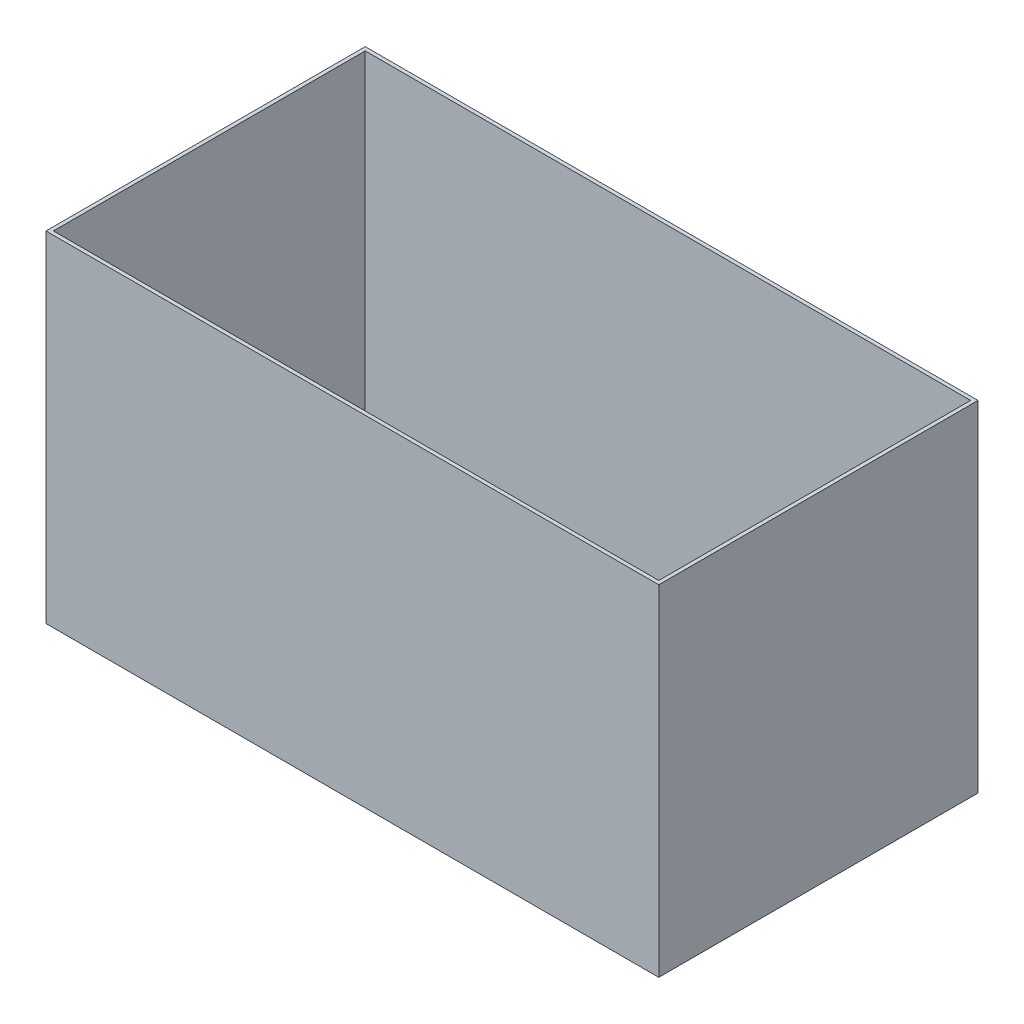
ISO-10303-21;
HEADER;
FILE_DESCRIPTION(('STEP AP214'),'2;1');
FILE_NAME('part.step','',(''),(''),'','','');
FILE_SCHEMA(('AUTOMOTIVE_DESIGN { 1 0 10303 214 1 1 1 1 }'));
ENDSEC;
DATA;
#1=APPLICATION_CONTEXT('core data for automotive mechanical design processes');
#2=APPLICATION_PROTOCOL_DEFINITION('international standard','automotive_design',2000,#1);
#3=PRODUCT_CONTEXT('',#1,'mechanical');
#4=PRODUCT('Part','Part','',(#3));
#5=PRODUCT_RELATED_PRODUCT_CATEGORY('part','',(#4));
#6=PRODUCT_DEFINITION_FORMATION('','',#4);
#7=PRODUCT_DEFINITION_CONTEXT('part definition',#1,'design');
#8=PRODUCT_DEFINITION('design','',#6,#7);
#9=PRODUCT_DEFINITION_SHAPE('','',#8);
#10=(LENGTH_UNIT() NAMED_UNIT(*) SI_UNIT(.MILLI.,.METRE.));
#11=(NAMED_UNIT(*) PLANE_ANGLE_UNIT() SI_UNIT($,.RADIAN.));
#12=(NAMED_UNIT(*) SI_UNIT($,.STERADIAN.) SOLID_ANGLE_UNIT());
#13=UNCERTAINTY_MEASURE_WITH_UNIT(LENGTH_MEASURE(1.E-05),#10,'distance_accuracy_value','');
#14=(GEOMETRIC_REPRESENTATION_CONTEXT(3) GLOBAL_UNCERTAINTY_ASSIGNED_CONTEXT((#13)) GLOBAL_UNIT_ASSIGNED_CONTEXT((#10,
#11,#12)) REPRESENTATION_CONTEXT('',''));
#15=CARTESIAN_POINT('',(0.,0.,0.));
#16=DIRECTION('',(0.,0.,1.));
#17=DIRECTION('',(1.,0.,0.));
#18=AXIS2_PLACEMENT_3D('',#15,#16,#17);
#19=CARTESIAN_POINT('',(0.,550.,0.));
#20=DIRECTION('',(0.,-1.,0.));
#21=DIRECTION('',(0.,0.,-1.));
#22=AXIS2_PLACEMENT_3D('',#19,#20,#21);
#23=PLANE('',#22);
#24=DIRECTION('',(0.,0.,1.));
#25=VECTOR('',#24,1.);
#26=CARTESIAN_POINT('',(-237.318612733744,550.,0.));
#27=LINE('',#26,#25);
#28=CARTESIAN_POINT('',(-237.318612733744,550.,-559.187484374752));
#29=VERTEX_POINT('',#28);
#30=CARTESIAN_POINT('',(-237.318612733744,550.,-37.1874843747519));
#31=VERTEX_POINT('',#30);
#32=EDGE_CURVE('E156',#29,#31,#27,.T.);
#33=ORIENTED_EDGE('',*,*,#32,.T.);
#34=DIRECTION('',(1.,0.,0.));
#35=VECTOR('',#34,1.);
#36=CARTESIAN_POINT('',(0.,550.,-37.1874843747519));
#37=LINE('',#36,#35);
#38=CARTESIAN_POINT('',(764.681387266256,550.,-37.1874843747519));
#39=VERTEX_POINT('',#38);
#40=EDGE_CURVE('E158',#31,#39,#37,.T.);
#41=ORIENTED_EDGE('',*,*,#40,.T.);
#42=DIRECTION('',(0.,0.,-1.));
#43=VECTOR('',#42,1.);
#44=CARTESIAN_POINT('',(764.681387266256,550.,0.));
#45=LINE('',#44,#43);
#46=CARTESIAN_POINT('',(764.681387266256,550.,-559.187484374752));
#47=VERTEX_POINT('',#46);
#48=EDGE_CURVE('E159',#39,#47,#45,.T.);
#49=ORIENTED_EDGE('',*,*,#48,.T.);
#50=DIRECTION('',(-1.,0.,0.));
#51=VECTOR('',#50,1.);
#52=CARTESIAN_POINT('',(0.,550.,-559.187484374752));
#53=LINE('',#52,#51);
#54=EDGE_CURVE('E37',#47,#29,#53,.T.);
#55=ORIENTED_EDGE('',*,*,#54,.T.);
#56=EDGE_LOOP('',(#33,#41,#49,#55));
#57=FACE_BOUND('',#56,.T.);
#58=DIRECTION('',(0.,0.,1.));
#59=VECTOR('',#58,1.);
#60=CARTESIAN_POINT('',(-231.318612733744,550.,-43.1874843747519));
#61=LINE('',#60,#59);
#62=CARTESIAN_POINT('',(-231.318612733744,550.,-553.187484374752));
#63=VERTEX_POINT('',#62);
#64=CARTESIAN_POINT('',(-231.318612733744,550.,-43.1874843747519));
#65=VERTEX_POINT('',#64);
#66=EDGE_CURVE('E102',#63,#65,#61,.T.);
#67=ORIENTED_EDGE('',*,*,#66,.F.);
#68=DIRECTION('',(-1.,0.,0.));
#69=VECTOR('',#68,1.);
#70=CARTESIAN_POINT('',(-231.318612733744,550.,-553.187484374752));
#71=LINE('',#70,#69);
#72=CARTESIAN_POINT('',(758.681387266256,550.,-553.187484374752));
#73=VERTEX_POINT('',#72);
#74=EDGE_CURVE('E127',#73,#63,#71,.T.);
#75=ORIENTED_EDGE('',*,*,#74,.F.);
#76=DIRECTION('',(0.,0.,-1.));
#77=VECTOR('',#76,1.);
#78=CARTESIAN_POINT('',(758.681387266256,550.,-43.1874843747519));
#79=LINE('',#78,#77);
#80=CARTESIAN_POINT('',(758.681387266256,550.,-43.1874843747519));
#81=VERTEX_POINT('',#80);
#82=EDGE_CURVE('E125',#81,#73,#79,.T.);
#83=ORIENTED_EDGE('',*,*,#82,.F.);
#84=DIRECTION('',(1.,0.,0.));
#85=VECTOR('',#84,1.);
#86=CARTESIAN_POINT('',(-231.318612733744,550.,-43.1874843747519));
#87=LINE('',#86,#85);
#88=EDGE_CURVE('E113',#65,#81,#87,.T.);
#89=ORIENTED_EDGE('',*,*,#88,.F.);
#90=EDGE_LOOP('',(#67,#75,#83,#89));
#91=FACE_BOUND('',#90,.T.);
#92=ADVANCED_FACE('F33',(#57,#91),#23,.F.);
#93=CARTESIAN_POINT('',(-237.318612733744,550.,-43.1874843747519));
#94=DIRECTION('',(1.,0.,0.));
#95=DIRECTION('',(0.,0.,-1.));
#96=AXIS2_PLACEMENT_3D('',#93,#94,#95);
#97=PLANE('',#96);
#98=DIRECTION('',(0.,0.,1.));
#99=VECTOR('',#98,1.);
#100=CARTESIAN_POINT('',(-237.318612733744,-6.,0.));
#101=LINE('',#100,#99);
#102=CARTESIAN_POINT('',(-237.318612733744,-6.,-559.187484374752));
#103=VERTEX_POINT('',#102);
#104=CARTESIAN_POINT('',(-237.318612733744,-6.,-37.1874843747519));
#105=VERTEX_POINT('',#104);
#106=EDGE_CURVE('E121',#103,#105,#101,.T.);
#107=ORIENTED_EDGE('',*,*,#106,.T.);
#108=DIRECTION('',(0.,-1.,0.));
#109=VECTOR('',#108,1.);
#110=CARTESIAN_POINT('',(-237.318612733744,550.,-37.1874843747519));
#111=LINE('',#110,#109);
#112=EDGE_CURVE('E11',#31,#105,#111,.T.);
#113=ORIENTED_EDGE('',*,*,#112,.F.);
#114=ORIENTED_EDGE('',*,*,#32,.F.);
#115=DIRECTION('',(0.,-1.,0.));
#116=VECTOR('',#115,1.);
#117=CARTESIAN_POINT('',(-237.318612733744,550.,-559.187484374752));
#118=LINE('',#117,#116);
#119=EDGE_CURVE('E143',#29,#103,#118,.T.);
#120=ORIENTED_EDGE('',*,*,#119,.T.);
#121=EDGE_LOOP('',(#107,#113,#114,#120));
#122=FACE_BOUND('',#121,.T.);
#123=ADVANCED_FACE('F173',(#122),#97,.F.);
#124=CARTESIAN_POINT('',(-231.318612733744,550.,-37.1874843747519));
#125=DIRECTION('',(0.,0.,-1.));
#126=DIRECTION('',(-1.,0.,0.));
#127=AXIS2_PLACEMENT_3D('',#124,#125,#126);
#128=PLANE('',#127);
#129=DIRECTION('',(1.,0.,0.));
#130=VECTOR('',#129,1.);
#131=CARTESIAN_POINT('',(0.,-6.,-37.1874843747519));
#132=LINE('',#131,#130);
#133=CARTESIAN_POINT('',(764.681387266256,-6.,-37.1874843747519));
#134=VERTEX_POINT('',#133);
#135=EDGE_CURVE('E141',#105,#134,#132,.T.);
#136=ORIENTED_EDGE('',*,*,#135,.T.);
#137=DIRECTION('',(0.,-1.,0.));
#138=VECTOR('',#137,1.);
#139=CARTESIAN_POINT('',(764.681387266256,550.,-37.1874843747519));
#140=LINE('',#139,#138);
#141=EDGE_CURVE('E42',#39,#134,#140,.T.);
#142=ORIENTED_EDGE('',*,*,#141,.F.);
#143=ORIENTED_EDGE('',*,*,#40,.F.);
#144=ORIENTED_EDGE('',*,*,#112,.T.);
#145=EDGE_LOOP('',(#136,#142,#143,#144));
#146=FACE_BOUND('',#145,.T.);
#147=ADVANCED_FACE('F175',(#146),#128,.F.);
#148=CARTESIAN_POINT('',(764.681387266256,550.,-43.1874843747519));
#149=DIRECTION('',(-1.,0.,0.));
#150=DIRECTION('',(0.,0.,1.));
#151=AXIS2_PLACEMENT_3D('',#148,#149,#150);
#152=PLANE('',#151);
#153=DIRECTION('',(0.,0.,-1.));
#154=VECTOR('',#153,1.);
#155=CARTESIAN_POINT('',(764.681387266256,-6.,0.));
#156=LINE('',#155,#154);
#157=CARTESIAN_POINT('',(764.681387266256,-6.,-559.187484374752));
#158=VERTEX_POINT('',#157);
#159=EDGE_CURVE('E148',#134,#158,#156,.T.);
#160=ORIENTED_EDGE('',*,*,#159,.T.);
#161=DIRECTION('',(0.,-1.,0.));
#162=VECTOR('',#161,1.);
#163=CARTESIAN_POINT('',(764.681387266256,550.,-559.187484374752));
#164=LINE('',#163,#162);
#165=EDGE_CURVE('E146',#47,#158,#164,.T.);
#166=ORIENTED_EDGE('',*,*,#165,.F.);
#167=ORIENTED_EDGE('',*,*,#48,.F.);
#168=ORIENTED_EDGE('',*,*,#141,.T.);
#169=EDGE_LOOP('',(#160,#166,#167,#168));
#170=FACE_BOUND('',#169,.T.);
#171=ADVANCED_FACE('F164',(#170),#152,.F.);
#172=CARTESIAN_POINT('',(-231.318612733744,550.,-559.187484374752));
#173=DIRECTION('',(0.,0.,1.));
#174=DIRECTION('',(1.,0.,0.));
#175=AXIS2_PLACEMENT_3D('',#172,#173,#174);
#176=PLANE('',#175);
#177=DIRECTION('',(-1.,0.,0.));
#178=VECTOR('',#177,1.);
#179=CARTESIAN_POINT('',(0.,-6.,-559.187484374752));
#180=LINE('',#179,#178);
#181=EDGE_CURVE('E152',#158,#103,#180,.T.);
#182=ORIENTED_EDGE('',*,*,#181,.T.);
#183=ORIENTED_EDGE('',*,*,#119,.F.);
#184=ORIENTED_EDGE('',*,*,#54,.F.);
#185=ORIENTED_EDGE('',*,*,#165,.T.);
#186=EDGE_LOOP('',(#182,#183,#184,#185));
#187=FACE_BOUND('',#186,.T.);
#188=ADVANCED_FACE('F168',(#187),#176,.F.);
#189=CARTESIAN_POINT('',(0.,-6.,0.));
#190=DIRECTION('',(0.,-1.,0.));
#191=DIRECTION('',(0.,0.,-1.));
#192=AXIS2_PLACEMENT_3D('',#189,#190,#191);
#193=PLANE('',#192);
#194=ORIENTED_EDGE('',*,*,#106,.F.);
#195=ORIENTED_EDGE('',*,*,#181,.F.);
#196=ORIENTED_EDGE('',*,*,#159,.F.);
#197=ORIENTED_EDGE('',*,*,#135,.F.);
#198=EDGE_LOOP('',(#194,#195,#196,#197));
#199=FACE_BOUND('',#198,.T.);
#200=ADVANCED_FACE('F35',(#199),#193,.T.);
#201=CARTESIAN_POINT('',(-231.318612733744,550.,-43.1874843747519));
#202=DIRECTION('',(1.,0.,0.));
#203=DIRECTION('',(0.,0.,-1.));
#204=AXIS2_PLACEMENT_3D('',#201,#202,#203);
#205=PLANE('',#204);
#206=DIRECTION('',(0.,0.,1.));
#207=VECTOR('',#206,1.);
#208=CARTESIAN_POINT('',(-231.318612733744,0.,-43.1874843747519));
#209=LINE('',#208,#207);
#210=CARTESIAN_POINT('',(-231.318612733744,0.,-553.187484374752));
#211=VERTEX_POINT('',#210);
#212=CARTESIAN_POINT('',(-231.318612733744,0.,-43.1874843747519));
#213=VERTEX_POINT('',#212);
#214=EDGE_CURVE('E131',#211,#213,#209,.T.);
#215=ORIENTED_EDGE('',*,*,#214,.F.);
#216=DIRECTION('',(0.,-1.,0.));
#217=VECTOR('',#216,1.);
#218=CARTESIAN_POINT('',(-231.318612733744,550.,-553.187484374752));
#219=LINE('',#218,#217);
#220=EDGE_CURVE('E109',#63,#211,#219,.T.);
#221=ORIENTED_EDGE('',*,*,#220,.F.);
#222=ORIENTED_EDGE('',*,*,#66,.T.);
#223=DIRECTION('',(0.,-1.,0.));
#224=VECTOR('',#223,1.);
#225=CARTESIAN_POINT('',(-231.318612733744,550.,-43.1874843747519));
#226=LINE('',#225,#224);
#227=EDGE_CURVE('E106',#65,#213,#226,.T.);
#228=ORIENTED_EDGE('',*,*,#227,.T.);
#229=EDGE_LOOP('',(#215,#221,#222,#228));
#230=FACE_BOUND('',#229,.T.);
#231=ADVANCED_FACE('F105',(#230),#205,.T.);
#232=CARTESIAN_POINT('',(-231.318612733744,550.,-43.1874843747519));
#233=DIRECTION('',(0.,0.,-1.));
#234=DIRECTION('',(-1.,0.,0.));
#235=AXIS2_PLACEMENT_3D('',#232,#233,#234);
#236=PLANE('',#235);
#237=DIRECTION('',(1.,0.,0.));
#238=VECTOR('',#237,1.);
#239=CARTESIAN_POINT('',(-231.318612733744,0.,-43.1874843747519));
#240=LINE('',#239,#238);
#241=CARTESIAN_POINT('',(758.681387266256,0.,-43.1874843747519));
#242=VERTEX_POINT('',#241);
#243=EDGE_CURVE('E120',#213,#242,#240,.T.);
#244=ORIENTED_EDGE('',*,*,#243,.F.);
#245=ORIENTED_EDGE('',*,*,#227,.F.);
#246=ORIENTED_EDGE('',*,*,#88,.T.);
#247=DIRECTION('',(0.,-1.,0.));
#248=VECTOR('',#247,1.);
#249=CARTESIAN_POINT('',(758.681387266256,550.,-43.1874843747519));
#250=LINE('',#249,#248);
#251=EDGE_CURVE('E122',#81,#242,#250,.T.);
#252=ORIENTED_EDGE('',*,*,#251,.T.);
#253=EDGE_LOOP('',(#244,#245,#246,#252));
#254=FACE_BOUND('',#253,.T.);
#255=ADVANCED_FACE('F117',(#254),#236,.T.);
#256=CARTESIAN_POINT('',(758.681387266256,550.,-43.1874843747519));
#257=DIRECTION('',(-1.,0.,0.));
#258=DIRECTION('',(0.,0.,1.));
#259=AXIS2_PLACEMENT_3D('',#256,#257,#258);
#260=PLANE('',#259);
#261=DIRECTION('',(0.,0.,-1.));
#262=VECTOR('',#261,1.);
#263=CARTESIAN_POINT('',(758.681387266256,0.,-43.1874843747519));
#264=LINE('',#263,#262);
#265=CARTESIAN_POINT('',(758.681387266256,0.,-553.187484374752));
#266=VERTEX_POINT('',#265);
#267=EDGE_CURVE('E134',#242,#266,#264,.T.);
#268=ORIENTED_EDGE('',*,*,#267,.F.);
#269=ORIENTED_EDGE('',*,*,#251,.F.);
#270=ORIENTED_EDGE('',*,*,#82,.T.);
#271=DIRECTION('',(0.,-1.,0.));
#272=VECTOR('',#271,1.);
#273=CARTESIAN_POINT('',(758.681387266256,550.,-553.187484374752));
#274=LINE('',#273,#272);
#275=EDGE_CURVE('E50',#73,#266,#274,.T.);
#276=ORIENTED_EDGE('',*,*,#275,.T.);
#277=EDGE_LOOP('',(#268,#269,#270,#276));
#278=FACE_BOUND('',#277,.T.);
#279=ADVANCED_FACE('F222',(#278),#260,.T.);
#280=CARTESIAN_POINT('',(-231.318612733744,550.,-553.187484374752));
#281=DIRECTION('',(0.,0.,1.));
#282=DIRECTION('',(1.,0.,0.));
#283=AXIS2_PLACEMENT_3D('',#280,#281,#282);
#284=PLANE('',#283);
#285=DIRECTION('',(-1.,0.,0.));
#286=VECTOR('',#285,1.);
#287=CARTESIAN_POINT('',(-231.318612733744,0.,-553.187484374752));
#288=LINE('',#287,#286);
#289=EDGE_CURVE('E114',#266,#211,#288,.T.);
#290=ORIENTED_EDGE('',*,*,#289,.F.);
#291=ORIENTED_EDGE('',*,*,#275,.F.);
#292=ORIENTED_EDGE('',*,*,#74,.T.);
#293=ORIENTED_EDGE('',*,*,#220,.T.);
#294=EDGE_LOOP('',(#290,#291,#292,#293));
#295=FACE_BOUND('',#294,.T.);
#296=ADVANCED_FACE('F230',(#295),#284,.T.);
#297=CARTESIAN_POINT('',(0.,0.,0.));
#298=DIRECTION('',(0.,-1.,0.));
#299=DIRECTION('',(0.,0.,-1.));
#300=AXIS2_PLACEMENT_3D('',#297,#298,#299);
#301=PLANE('',#300);
#302=ORIENTED_EDGE('',*,*,#214,.T.);
#303=ORIENTED_EDGE('',*,*,#243,.T.);
#304=ORIENTED_EDGE('',*,*,#267,.T.);
#305=ORIENTED_EDGE('',*,*,#289,.T.);
#306=EDGE_LOOP('',(#302,#303,#304,#305));
#307=FACE_BOUND('',#306,.T.);
#308=ADVANCED_FACE('F240',(#307),#301,.F.);
#309=CLOSED_SHELL('',(#92,#123,#147,#171,#188,#200,#231,#255,#279,#296,#308));
#310=MANIFOLD_SOLID_BREP('B2',#309);
#311=ADVANCED_BREP_SHAPE_REPRESENTATION('',(#18,#310),#14);
#312=SHAPE_DEFINITION_REPRESENTATION(#9,#311);
ENDSEC;
END-ISO-10303-21;
